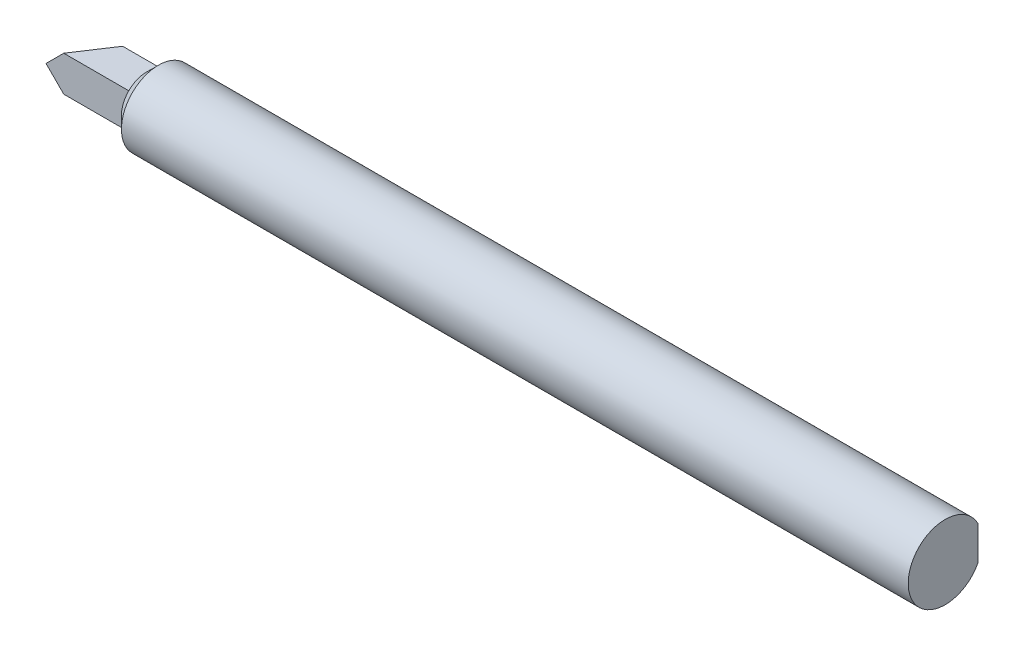
ISO-10303-21;
HEADER;
FILE_DESCRIPTION(('STEP AP214'),'2;1');
FILE_NAME('part.step','',(''),(''),'','','');
FILE_SCHEMA(('AUTOMOTIVE_DESIGN { 1 0 10303 214 1 1 1 1 }'));
ENDSEC;
DATA;
#1=APPLICATION_CONTEXT('core data for automotive mechanical design processes');
#2=APPLICATION_PROTOCOL_DEFINITION('international standard','automotive_design',2000,#1);
#3=PRODUCT_CONTEXT('',#1,'mechanical');
#4=PRODUCT('Part','Part','',(#3));
#5=PRODUCT_RELATED_PRODUCT_CATEGORY('part','',(#4));
#6=PRODUCT_DEFINITION_FORMATION('','',#4);
#7=PRODUCT_DEFINITION_CONTEXT('part definition',#1,'design');
#8=PRODUCT_DEFINITION('design','',#6,#7);
#9=PRODUCT_DEFINITION_SHAPE('','',#8);
#10=(LENGTH_UNIT() NAMED_UNIT(*) SI_UNIT(.MILLI.,.METRE.));
#11=(NAMED_UNIT(*) PLANE_ANGLE_UNIT() SI_UNIT($,.RADIAN.));
#12=(NAMED_UNIT(*) SI_UNIT($,.STERADIAN.) SOLID_ANGLE_UNIT());
#13=UNCERTAINTY_MEASURE_WITH_UNIT(LENGTH_MEASURE(1.E-05),#10,'distance_accuracy_value','');
#14=(GEOMETRIC_REPRESENTATION_CONTEXT(3) GLOBAL_UNCERTAINTY_ASSIGNED_CONTEXT((#13)) GLOBAL_UNIT_ASSIGNED_CONTEXT((#10,
#11,#12)) REPRESENTATION_CONTEXT('',''));
#15=CARTESIAN_POINT('',(0.,0.,0.));
#16=DIRECTION('',(0.,0.,1.));
#17=DIRECTION('',(1.,0.,0.));
#18=AXIS2_PLACEMENT_3D('',#15,#16,#17);
#19=CARTESIAN_POINT('',(0.254,0.,0.));
#20=DIRECTION('',(1.,0.,0.));
#21=DIRECTION('',(0.,0.,-1.));
#22=AXIS2_PLACEMENT_3D('',#19,#20,#21);
#23=CONICAL_SURFACE('',#22,0.79375,0.785398163397447);
#24=CARTESIAN_POINT('',(0.254,0.,0.));
#25=DIRECTION('',(1.,0.,0.));
#26=DIRECTION('',(0.,0.,-1.));
#27=AXIS2_PLACEMENT_3D('',#24,#25,#26);
#28=CIRCLE('',#27,0.79375);
#29=CARTESIAN_POINT('',(0.254,0.,-0.79375));
#30=VERTEX_POINT('',#29);
#31=EDGE_CURVE('E157',#30,#30,#28,.T.);
#32=ORIENTED_EDGE('',*,*,#31,.F.);
#33=EDGE_LOOP('',(#32));
#34=FACE_BOUND('',#33,.T.);
#35=CARTESIAN_POINT('',(0.,0.,0.));
#36=DIRECTION('',(-1.,0.,0.));
#37=DIRECTION('',(0.,0.,-1.));
#38=AXIS2_PLACEMENT_3D('',#35,#36,#37);
#39=CIRCLE('',#38,0.53975);
#40=CARTESIAN_POINT('',(0.,0.,-0.53975));
#41=VERTEX_POINT('',#40);
#42=EDGE_CURVE('E38',#41,#41,#39,.T.);
#43=ORIENTED_EDGE('',*,*,#42,.F.);
#44=EDGE_LOOP('',(#43));
#45=FACE_BOUND('',#44,.T.);
#46=ADVANCED_FACE('F15',(#34,#45),#23,.T.);
#47=CARTESIAN_POINT('',(6.604,0.,0.));
#48=DIRECTION('',(1.,0.,0.));
#49=DIRECTION('',(0.,1.,0.));
#50=AXIS2_PLACEMENT_3D('',#47,#48,#49);
#51=PLANE('',#50);
#52=CARTESIAN_POINT('',(6.604,0.,0.));
#53=DIRECTION('',(1.,0.,0.));
#54=DIRECTION('',(0.,0.,-1.));
#55=AXIS2_PLACEMENT_3D('',#52,#53,#54);
#56=CIRCLE('',#55,0.79375);
#57=CARTESIAN_POINT('',(6.604,-0.365000739725277,-0.70485));
#58=VERTEX_POINT('',#57);
#59=CARTESIAN_POINT('',(6.604,0.365000739725276,-0.70485));
#60=VERTEX_POINT('',#59);
#61=EDGE_CURVE('E139',#58,#60,#56,.T.);
#62=ORIENTED_EDGE('',*,*,#61,.T.);
#63=DIRECTION('',(0.,-1.,0.));
#64=VECTOR('',#63,1.);
#65=CARTESIAN_POINT('',(6.604,0.,-0.70485));
#66=LINE('',#65,#64);
#67=EDGE_CURVE('E10',#60,#58,#66,.T.);
#68=ORIENTED_EDGE('',*,*,#67,.T.);
#69=EDGE_LOOP('',(#62,#68));
#70=FACE_BOUND('',#69,.T.);
#71=ADVANCED_FACE('F278',(#70),#51,.T.);
#72=CARTESIAN_POINT('',(6.604,0.,-0.70485));
#73=DIRECTION('',(0.,0.,1.));
#74=DIRECTION('',(1.,0.,0.));
#75=AXIS2_PLACEMENT_3D('',#72,#73,#74);
#76=PLANE('',#75);
#77=DIRECTION('',(0.,-1.,0.));
#78=VECTOR('',#77,1.);
#79=CARTESIAN_POINT('',(17.145,0.,-0.70485));
#80=LINE('',#79,#78);
#81=CARTESIAN_POINT('',(17.145,0.365000739725276,-0.70485));
#82=VERTEX_POINT('',#81);
#83=CARTESIAN_POINT('',(17.145,-0.365000739725277,-0.70485));
#84=VERTEX_POINT('',#83);
#85=EDGE_CURVE('E132',#82,#84,#80,.T.);
#86=ORIENTED_EDGE('',*,*,#85,.T.);
#87=DIRECTION('',(1.,0.,0.));
#88=VECTOR('',#87,1.);
#89=CARTESIAN_POINT('',(6.604,-0.365000739725277,-0.70485));
#90=LINE('',#89,#88);
#91=EDGE_CURVE('E134',#58,#84,#90,.T.);
#92=ORIENTED_EDGE('',*,*,#91,.F.);
#93=ORIENTED_EDGE('',*,*,#67,.F.);
#94=DIRECTION('',(1.,0.,0.));
#95=VECTOR('',#94,1.);
#96=CARTESIAN_POINT('',(6.604,0.365000739725276,-0.70485));
#97=LINE('',#96,#95);
#98=EDGE_CURVE('E143',#60,#82,#97,.T.);
#99=ORIENTED_EDGE('',*,*,#98,.T.);
#100=EDGE_LOOP('',(#86,#92,#93,#99));
#101=FACE_BOUND('',#100,.T.);
#102=ADVANCED_FACE('F17',(#101),#76,.F.);
#103=CARTESIAN_POINT('',(-19.6128853760949,-18.0861391081817,0.));
#104=DIRECTION('',(0.640856382055789,-0.640856382055789,0.422618261740699));
#105=DIRECTION('',(0.,-0.55052734748463,-0.834817129478988));
#106=AXIS2_PLACEMENT_3D('',#103,#104,#105);
#107=PLANE('',#106);
#108=DIRECTION('',(0.707106781186548,0.707106781186548,0.));
#109=VECTOR('',#108,1.);
#110=CARTESIAN_POINT('',(-19.4872585100514,-18.2117659742252,-0.381));
#111=LINE('',#110,#109);
#112=CARTESIAN_POINT('',(-1.27549253582626,0.,-0.381));
#113=VERTEX_POINT('',#112);
#114=CARTESIAN_POINT('',(-0.894492535826266,0.381,-0.381));
#115=VERTEX_POINT('',#114);
#116=EDGE_CURVE('E153',#113,#115,#111,.T.);
#117=ORIENTED_EDGE('',*,*,#116,.F.);
#118=DIRECTION('',(-0.55052734748463,0.,0.834817129478988));
#119=VECTOR('',#118,1.);
#120=CARTESIAN_POINT('',(-7.00829982577156,0.,8.31220252211805));
#121=LINE('',#120,#119);
#122=CARTESIAN_POINT('',(-1.778,0.,0.381));
#123=VERTEX_POINT('',#122);
#124=EDGE_CURVE('E26',#113,#123,#121,.T.);
#125=ORIENTED_EDGE('',*,*,#124,.T.);
#126=DIRECTION('',(0.707106781186548,0.707106781186548,0.));
#127=VECTOR('',#126,1.);
#128=CARTESIAN_POINT('',(-19.7385122421383,-17.9605122421383,0.381));
#129=LINE('',#128,#127);
#130=CARTESIAN_POINT('',(-1.397,0.381,0.381));
#131=VERTEX_POINT('',#130);
#132=EDGE_CURVE('E112',#123,#131,#129,.T.);
#133=ORIENTED_EDGE('',*,*,#132,.T.);
#134=DIRECTION('',(-0.55052734748463,0.,0.834817129478988));
#135=VECTOR('',#134,1.);
#136=CARTESIAN_POINT('',(-1.33736995685303,0.381,0.290577277717255));
#137=LINE('',#136,#135);
#138=EDGE_CURVE('E19',#115,#131,#137,.T.);
#139=ORIENTED_EDGE('',*,*,#138,.F.);
#140=EDGE_LOOP('',(#117,#125,#133,#139));
#141=FACE_BOUND('',#140,.T.);
#142=ADVANCED_FACE('F119',(#141),#107,.F.);
#143=CARTESIAN_POINT('',(-19.6128853760949,18.0861391081817,0.));
#144=DIRECTION('',(-0.640856382055789,-0.640856382055789,-0.422618261740699));
#145=DIRECTION('',(-0.707106781186548,0.707106781186548,0.));
#146=AXIS2_PLACEMENT_3D('',#143,#144,#145);
#147=PLANE('',#146);
#148=ORIENTED_EDGE('',*,*,#124,.F.);
#149=DIRECTION('',(0.707106781186548,-0.707106781186548,0.));
#150=VECTOR('',#149,1.);
#151=CARTESIAN_POINT('',(-19.4872585100514,18.2117659742252,-0.381));
#152=LINE('',#151,#150);
#153=CARTESIAN_POINT('',(-0.894492535826266,-0.381,-0.381));
#154=VERTEX_POINT('',#153);
#155=EDGE_CURVE('E117',#113,#154,#152,.T.);
#156=ORIENTED_EDGE('',*,*,#155,.T.);
#157=DIRECTION('',(0.55052734748463,0.,-0.834817129478988));
#158=VECTOR('',#157,1.);
#159=CARTESIAN_POINT('',(-1.33736995685303,-0.381,0.290577277717255));
#160=LINE('',#159,#158);
#161=CARTESIAN_POINT('',(-1.397,-0.381,0.381));
#162=VERTEX_POINT('',#161);
#163=EDGE_CURVE('E144',#162,#154,#160,.T.);
#164=ORIENTED_EDGE('',*,*,#163,.F.);
#165=DIRECTION('',(0.707106781186548,-0.707106781186548,0.));
#166=VECTOR('',#165,1.);
#167=CARTESIAN_POINT('',(-19.7385122421383,17.9605122421383,0.381));
#168=LINE('',#167,#166);
#169=EDGE_CURVE('E122',#123,#162,#168,.T.);
#170=ORIENTED_EDGE('',*,*,#169,.F.);
#171=EDGE_LOOP('',(#148,#156,#164,#170));
#172=FACE_BOUND('',#171,.T.);
#173=ADVANCED_FACE('F194',(#172),#147,.T.);
#174=CARTESIAN_POINT('',(0.,0.,0.));
#175=DIRECTION('',(1.,0.,0.));
#176=DIRECTION('',(0.,1.,0.));
#177=AXIS2_PLACEMENT_3D('',#174,#175,#176);
#178=PLANE('',#177);
#179=DIRECTION('',(0.,1.,0.));
#180=VECTOR('',#179,1.);
#181=CARTESIAN_POINT('',(0.,0.,0.381));
#182=LINE('',#181,#180);
#183=CARTESIAN_POINT('',(0.,-0.381,0.381));
#184=VERTEX_POINT('',#183);
#185=CARTESIAN_POINT('',(0.,0.381,0.381));
#186=VERTEX_POINT('',#185);
#187=EDGE_CURVE('E115',#184,#186,#182,.T.);
#188=ORIENTED_EDGE('',*,*,#187,.F.);
#189=DIRECTION('',(0.,0.,-1.));
#190=VECTOR('',#189,1.);
#191=CARTESIAN_POINT('',(0.,-0.381,0.));
#192=LINE('',#191,#190);
#193=CARTESIAN_POINT('',(0.,-0.381,-0.381));
#194=VERTEX_POINT('',#193);
#195=EDGE_CURVE('E107',#184,#194,#192,.T.);
#196=ORIENTED_EDGE('',*,*,#195,.T.);
#197=DIRECTION('',(0.,1.,0.));
#198=VECTOR('',#197,1.);
#199=CARTESIAN_POINT('',(0.,0.,-0.381));
#200=LINE('',#199,#198);
#201=CARTESIAN_POINT('',(0.,0.381,-0.381));
#202=VERTEX_POINT('',#201);
#203=EDGE_CURVE('E152',#194,#202,#200,.T.);
#204=ORIENTED_EDGE('',*,*,#203,.T.);
#205=DIRECTION('',(0.,0.,-1.));
#206=VECTOR('',#205,1.);
#207=CARTESIAN_POINT('',(0.,0.381,0.));
#208=LINE('',#207,#206);
#209=EDGE_CURVE('E106',#186,#202,#208,.T.);
#210=ORIENTED_EDGE('',*,*,#209,.F.);
#211=EDGE_LOOP('',(#188,#196,#204,#210));
#212=FACE_BOUND('',#211,.T.);
#213=ORIENTED_EDGE('',*,*,#42,.T.);
#214=EDGE_LOOP('',(#213));
#215=FACE_BOUND('',#214,.T.);
#216=ADVANCED_FACE('F299',(#212,#215),#178,.F.);
#217=CARTESIAN_POINT('',(17.145,0.,0.));
#218=DIRECTION('',(1.,0.,0.));
#219=DIRECTION('',(0.,1.,0.));
#220=AXIS2_PLACEMENT_3D('',#217,#218,#219);
#221=PLANE('',#220);
#222=ORIENTED_EDGE('',*,*,#85,.F.);
#223=CARTESIAN_POINT('',(17.145,0.,0.));
#224=DIRECTION('',(1.,0.,0.));
#225=DIRECTION('',(0.,0.,-1.));
#226=AXIS2_PLACEMENT_3D('',#223,#224,#225);
#227=CIRCLE('',#226,0.79375);
#228=EDGE_CURVE('E138',#82,#84,#227,.T.);
#229=ORIENTED_EDGE('',*,*,#228,.T.);
#230=EDGE_LOOP('',(#222,#229));
#231=FACE_BOUND('',#230,.T.);
#232=ADVANCED_FACE('F307',(#231),#221,.T.);
#233=CARTESIAN_POINT('',(17.145,0.,0.));
#234=DIRECTION('',(-1.,0.,0.));
#235=DIRECTION('',(0.,0.,1.));
#236=AXIS2_PLACEMENT_3D('',#233,#234,#235);
#237=CYLINDRICAL_SURFACE('',#236,0.79375);
#238=ORIENTED_EDGE('',*,*,#61,.F.);
#239=ORIENTED_EDGE('',*,*,#91,.T.);
#240=ORIENTED_EDGE('',*,*,#228,.F.);
#241=ORIENTED_EDGE('',*,*,#98,.F.);
#242=EDGE_LOOP('',(#238,#239,#240,#241));
#243=FACE_BOUND('',#242,.T.);
#244=ORIENTED_EDGE('',*,*,#31,.T.);
#245=EDGE_LOOP('',(#244));
#246=FACE_BOUND('',#245,.T.);
#247=ADVANCED_FACE('F265',(#243,#246),#237,.T.);
#248=CARTESIAN_POINT('',(-1.778,0.381,0.));
#249=DIRECTION('',(0.,-1.,0.));
#250=DIRECTION('',(0.,0.,-1.));
#251=AXIS2_PLACEMENT_3D('',#248,#249,#250);
#252=PLANE('',#251);
#253=DIRECTION('',(1.,0.,0.));
#254=VECTOR('',#253,1.);
#255=CARTESIAN_POINT('',(-1.778,0.381,-0.381));
#256=LINE('',#255,#254);
#257=EDGE_CURVE('E100',#115,#202,#256,.T.);
#258=ORIENTED_EDGE('',*,*,#257,.F.);
#259=ORIENTED_EDGE('',*,*,#138,.T.);
#260=DIRECTION('',(1.,0.,0.));
#261=VECTOR('',#260,1.);
#262=CARTESIAN_POINT('',(-1.778,0.381,0.381));
#263=LINE('',#262,#261);
#264=EDGE_CURVE('E97',#131,#186,#263,.T.);
#265=ORIENTED_EDGE('',*,*,#264,.T.);
#266=ORIENTED_EDGE('',*,*,#209,.T.);
#267=EDGE_LOOP('',(#258,#259,#265,#266));
#268=FACE_BOUND('',#267,.T.);
#269=ADVANCED_FACE('F96',(#268),#252,.F.);
#270=CARTESIAN_POINT('',(-1.778,-0.381,0.));
#271=DIRECTION('',(0.,-1.,0.));
#272=DIRECTION('',(0.,0.,-1.));
#273=AXIS2_PLACEMENT_3D('',#270,#271,#272);
#274=PLANE('',#273);
#275=DIRECTION('',(1.,0.,0.));
#276=VECTOR('',#275,1.);
#277=CARTESIAN_POINT('',(-1.778,-0.381,0.381));
#278=LINE('',#277,#276);
#279=EDGE_CURVE('E128',#162,#184,#278,.T.);
#280=ORIENTED_EDGE('',*,*,#279,.F.);
#281=ORIENTED_EDGE('',*,*,#163,.T.);
#282=DIRECTION('',(1.,0.,0.));
#283=VECTOR('',#282,1.);
#284=CARTESIAN_POINT('',(-1.778,-0.381,-0.381));
#285=LINE('',#284,#283);
#286=EDGE_CURVE('E147',#154,#194,#285,.T.);
#287=ORIENTED_EDGE('',*,*,#286,.T.);
#288=ORIENTED_EDGE('',*,*,#195,.F.);
#289=EDGE_LOOP('',(#280,#281,#287,#288));
#290=FACE_BOUND('',#289,.T.);
#291=ADVANCED_FACE('F264',(#290),#274,.T.);
#292=CARTESIAN_POINT('',(-1.778,0.,-0.381));
#293=DIRECTION('',(0.,0.,-1.));
#294=DIRECTION('',(0.,-1.,0.));
#295=AXIS2_PLACEMENT_3D('',#292,#293,#294);
#296=PLANE('',#295);
#297=ORIENTED_EDGE('',*,*,#155,.F.);
#298=ORIENTED_EDGE('',*,*,#116,.T.);
#299=ORIENTED_EDGE('',*,*,#257,.T.);
#300=ORIENTED_EDGE('',*,*,#203,.F.);
#301=ORIENTED_EDGE('',*,*,#286,.F.);
#302=EDGE_LOOP('',(#297,#298,#299,#300,#301));
#303=FACE_BOUND('',#302,.T.);
#304=ADVANCED_FACE('F198',(#303),#296,.T.);
#305=CARTESIAN_POINT('',(-1.778,0.,0.381));
#306=DIRECTION('',(0.,0.,-1.));
#307=DIRECTION('',(0.,-1.,0.));
#308=AXIS2_PLACEMENT_3D('',#305,#306,#307);
#309=PLANE('',#308);
#310=ORIENTED_EDGE('',*,*,#132,.F.);
#311=ORIENTED_EDGE('',*,*,#169,.T.);
#312=ORIENTED_EDGE('',*,*,#279,.T.);
#313=ORIENTED_EDGE('',*,*,#187,.T.);
#314=ORIENTED_EDGE('',*,*,#264,.F.);
#315=EDGE_LOOP('',(#310,#311,#312,#313,#314));
#316=FACE_BOUND('',#315,.T.);
#317=ADVANCED_FACE('F110',(#316),#309,.F.);
#318=CLOSED_SHELL('',(#46,#71,#102,#142,#173,#216,#232,#247,#269,#291,#304,#317));
#319=MANIFOLD_SOLID_BREP('B1',#318);
#320=ADVANCED_BREP_SHAPE_REPRESENTATION('',(#18,#319),#14);
#321=SHAPE_DEFINITION_REPRESENTATION(#9,#320);
ENDSEC;
END-ISO-10303-21;
